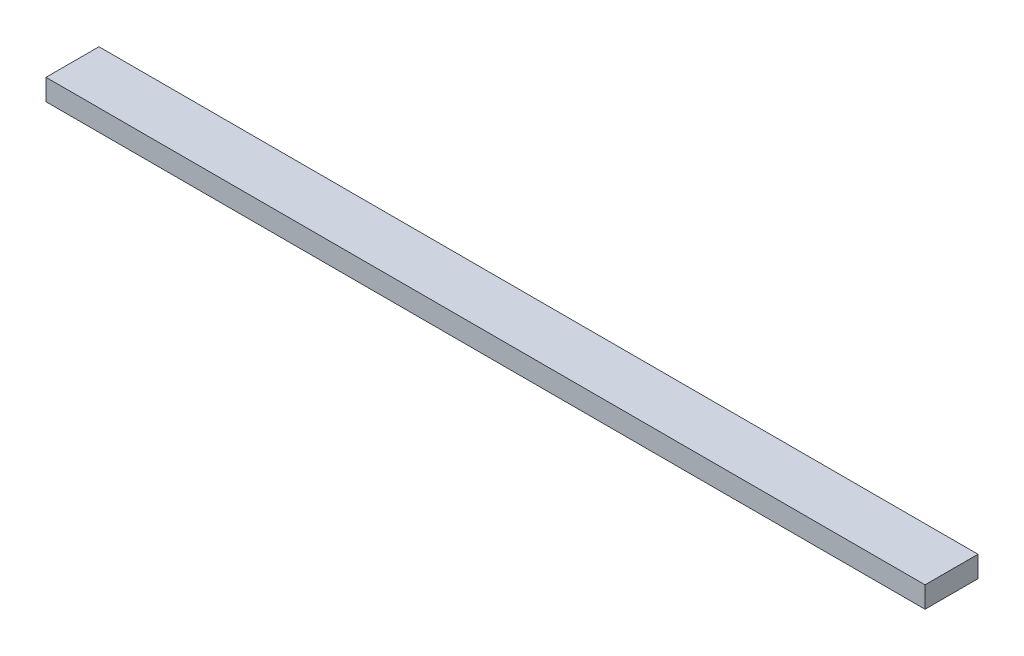
ISO-10303-21;
HEADER;
FILE_DESCRIPTION(('STEP AP214'),'2;1');
FILE_NAME('part.step','',(''),(''),'','','');
FILE_SCHEMA(('AUTOMOTIVE_DESIGN { 1 0 10303 214 1 1 1 1 }'));
ENDSEC;
DATA;
#1=APPLICATION_CONTEXT('core data for automotive mechanical design processes');
#2=APPLICATION_PROTOCOL_DEFINITION('international standard','automotive_design',2000,#1);
#3=PRODUCT_CONTEXT('',#1,'mechanical');
#4=PRODUCT('Part','Part','',(#3));
#5=PRODUCT_RELATED_PRODUCT_CATEGORY('part','',(#4));
#6=PRODUCT_DEFINITION_FORMATION('','',#4);
#7=PRODUCT_DEFINITION_CONTEXT('part definition',#1,'design');
#8=PRODUCT_DEFINITION('design','',#6,#7);
#9=PRODUCT_DEFINITION_SHAPE('','',#8);
#10=(LENGTH_UNIT() NAMED_UNIT(*) SI_UNIT(.MILLI.,.METRE.));
#11=(NAMED_UNIT(*) PLANE_ANGLE_UNIT() SI_UNIT($,.RADIAN.));
#12=(NAMED_UNIT(*) SI_UNIT($,.STERADIAN.) SOLID_ANGLE_UNIT());
#13=UNCERTAINTY_MEASURE_WITH_UNIT(LENGTH_MEASURE(1.E-05),#10,'distance_accuracy_value','');
#14=(GEOMETRIC_REPRESENTATION_CONTEXT(3) GLOBAL_UNCERTAINTY_ASSIGNED_CONTEXT((#13)) GLOBAL_UNIT_ASSIGNED_CONTEXT((#10,
#11,#12)) REPRESENTATION_CONTEXT('',''));
#15=CARTESIAN_POINT('',(0.,0.,0.));
#16=DIRECTION('',(0.,0.,1.));
#17=DIRECTION('',(1.,0.,0.));
#18=AXIS2_PLACEMENT_3D('',#15,#16,#17);
#19=CARTESIAN_POINT('',(0.,10.,-25.));
#20=DIRECTION('',(1.,0.,0.));
#21=DIRECTION('',(0.,0.,-1.));
#22=AXIS2_PLACEMENT_3D('',#19,#20,#21);
#23=PLANE('',#22);
#24=DIRECTION('',(0.,0.,1.));
#25=VECTOR('',#24,1.);
#26=CARTESIAN_POINT('',(0.,0.,-25.));
#27=LINE('',#26,#25);
#28=CARTESIAN_POINT('',(0.,0.,-25.));
#29=VERTEX_POINT('',#28);
#30=CARTESIAN_POINT('',(0.,0.,0.));
#31=VERTEX_POINT('',#30);
#32=EDGE_CURVE('E97',#29,#31,#27,.T.);
#33=ORIENTED_EDGE('',*,*,#32,.T.);
#34=DIRECTION('',(0.,-1.,0.));
#35=VECTOR('',#34,1.);
#36=CARTESIAN_POINT('',(0.,10.,0.));
#37=LINE('',#36,#35);
#38=CARTESIAN_POINT('',(0.,10.,0.));
#39=VERTEX_POINT('',#38);
#40=EDGE_CURVE('E11',#39,#31,#37,.T.);
#41=ORIENTED_EDGE('',*,*,#40,.F.);
#42=DIRECTION('',(0.,0.,1.));
#43=VECTOR('',#42,1.);
#44=CARTESIAN_POINT('',(0.,10.,-25.));
#45=LINE('',#44,#43);
#46=CARTESIAN_POINT('',(0.,10.,-25.));
#47=VERTEX_POINT('',#46);
#48=EDGE_CURVE('E85',#47,#39,#45,.T.);
#49=ORIENTED_EDGE('',*,*,#48,.F.);
#50=DIRECTION('',(0.,-1.,0.));
#51=VECTOR('',#50,1.);
#52=CARTESIAN_POINT('',(0.,10.,-25.));
#53=LINE('',#52,#51);
#54=EDGE_CURVE('E93',#47,#29,#53,.T.);
#55=ORIENTED_EDGE('',*,*,#54,.T.);
#56=EDGE_LOOP('',(#33,#41,#49,#55));
#57=FACE_BOUND('',#56,.T.);
#58=ADVANCED_FACE('F34',(#57),#23,.F.);
#59=CARTESIAN_POINT('',(0.,10.,0.));
#60=DIRECTION('',(0.,0.,-1.));
#61=DIRECTION('',(-1.,0.,0.));
#62=AXIS2_PLACEMENT_3D('',#59,#60,#61);
#63=PLANE('',#62);
#64=DIRECTION('',(1.,0.,0.));
#65=VECTOR('',#64,1.);
#66=CARTESIAN_POINT('',(0.,0.,0.));
#67=LINE('',#66,#65);
#68=CARTESIAN_POINT('',(415.,0.,0.));
#69=VERTEX_POINT('',#68);
#70=EDGE_CURVE('E89',#31,#69,#67,.T.);
#71=ORIENTED_EDGE('',*,*,#70,.T.);
#72=DIRECTION('',(0.,-1.,0.));
#73=VECTOR('',#72,1.);
#74=CARTESIAN_POINT('',(415.,10.,0.));
#75=LINE('',#74,#73);
#76=CARTESIAN_POINT('',(415.,10.,0.));
#77=VERTEX_POINT('',#76);
#78=EDGE_CURVE('E42',#77,#69,#75,.T.);
#79=ORIENTED_EDGE('',*,*,#78,.F.);
#80=DIRECTION('',(1.,0.,0.));
#81=VECTOR('',#80,1.);
#82=CARTESIAN_POINT('',(0.,10.,0.));
#83=LINE('',#82,#81);
#84=EDGE_CURVE('E80',#39,#77,#83,.T.);
#85=ORIENTED_EDGE('',*,*,#84,.F.);
#86=ORIENTED_EDGE('',*,*,#40,.T.);
#87=EDGE_LOOP('',(#71,#79,#85,#86));
#88=FACE_BOUND('',#87,.T.);
#89=ADVANCED_FACE('F88',(#88),#63,.F.);
#90=CARTESIAN_POINT('',(415.,10.,-25.));
#91=DIRECTION('',(-1.,0.,0.));
#92=DIRECTION('',(0.,0.,1.));
#93=AXIS2_PLACEMENT_3D('',#90,#91,#92);
#94=PLANE('',#93);
#95=DIRECTION('',(0.,0.,-1.));
#96=VECTOR('',#95,1.);
#97=CARTESIAN_POINT('',(415.,0.,-25.));
#98=LINE('',#97,#96);
#99=CARTESIAN_POINT('',(415.,0.,-25.));
#100=VERTEX_POINT('',#99);
#101=EDGE_CURVE('E67',#69,#100,#98,.T.);
#102=ORIENTED_EDGE('',*,*,#101,.T.);
#103=DIRECTION('',(0.,-1.,0.));
#104=VECTOR('',#103,1.);
#105=CARTESIAN_POINT('',(415.,10.,-25.));
#106=LINE('',#105,#104);
#107=CARTESIAN_POINT('',(415.,10.,-25.));
#108=VERTEX_POINT('',#107);
#109=EDGE_CURVE('E90',#108,#100,#106,.T.);
#110=ORIENTED_EDGE('',*,*,#109,.F.);
#111=DIRECTION('',(0.,0.,-1.));
#112=VECTOR('',#111,1.);
#113=CARTESIAN_POINT('',(415.,10.,-25.));
#114=LINE('',#113,#112);
#115=EDGE_CURVE('E83',#77,#108,#114,.T.);
#116=ORIENTED_EDGE('',*,*,#115,.F.);
#117=ORIENTED_EDGE('',*,*,#78,.T.);
#118=EDGE_LOOP('',(#102,#110,#116,#117));
#119=FACE_BOUND('',#118,.T.);
#120=ADVANCED_FACE('F91',(#119),#94,.F.);
#121=CARTESIAN_POINT('',(0.,10.,-25.));
#122=DIRECTION('',(0.,0.,1.));
#123=DIRECTION('',(1.,0.,0.));
#124=AXIS2_PLACEMENT_3D('',#121,#122,#123);
#125=PLANE('',#124);
#126=DIRECTION('',(-1.,0.,0.));
#127=VECTOR('',#126,1.);
#128=CARTESIAN_POINT('',(0.,0.,-25.));
#129=LINE('',#128,#127);
#130=EDGE_CURVE('E73',#100,#29,#129,.T.);
#131=ORIENTED_EDGE('',*,*,#130,.T.);
#132=ORIENTED_EDGE('',*,*,#54,.F.);
#133=DIRECTION('',(-1.,0.,0.));
#134=VECTOR('',#133,1.);
#135=CARTESIAN_POINT('',(0.,10.,-25.));
#136=LINE('',#135,#134);
#137=EDGE_CURVE('E50',#108,#47,#136,.T.);
#138=ORIENTED_EDGE('',*,*,#137,.F.);
#139=ORIENTED_EDGE('',*,*,#109,.T.);
#140=EDGE_LOOP('',(#131,#132,#138,#139));
#141=FACE_BOUND('',#140,.T.);
#142=ADVANCED_FACE('F104',(#141),#125,.F.);
#143=CARTESIAN_POINT('',(0.,10.,0.));
#144=DIRECTION('',(0.,1.,0.));
#145=DIRECTION('',(0.,0.,1.));
#146=AXIS2_PLACEMENT_3D('',#143,#144,#145);
#147=PLANE('',#146);
#148=ORIENTED_EDGE('',*,*,#48,.T.);
#149=ORIENTED_EDGE('',*,*,#84,.T.);
#150=ORIENTED_EDGE('',*,*,#115,.T.);
#151=ORIENTED_EDGE('',*,*,#137,.T.);
#152=EDGE_LOOP('',(#148,#149,#150,#151));
#153=FACE_BOUND('',#152,.T.);
#154=ADVANCED_FACE('F81',(#153),#147,.T.);
#155=CARTESIAN_POINT('',(0.,0.,0.));
#156=DIRECTION('',(0.,1.,0.));
#157=DIRECTION('',(0.,0.,1.));
#158=AXIS2_PLACEMENT_3D('',#155,#156,#157);
#159=PLANE('',#158);
#160=ORIENTED_EDGE('',*,*,#32,.F.);
#161=ORIENTED_EDGE('',*,*,#130,.F.);
#162=ORIENTED_EDGE('',*,*,#101,.F.);
#163=ORIENTED_EDGE('',*,*,#70,.F.);
#164=EDGE_LOOP('',(#160,#161,#162,#163));
#165=FACE_BOUND('',#164,.T.);
#166=ADVANCED_FACE('F107',(#165),#159,.F.);
#167=CLOSED_SHELL('',(#58,#89,#120,#142,#154,#166));
#168=MANIFOLD_SOLID_BREP('B2',#167);
#169=ADVANCED_BREP_SHAPE_REPRESENTATION('',(#18,#168),#14);
#170=SHAPE_DEFINITION_REPRESENTATION(#9,#169);
ENDSEC;
END-ISO-10303-21;
